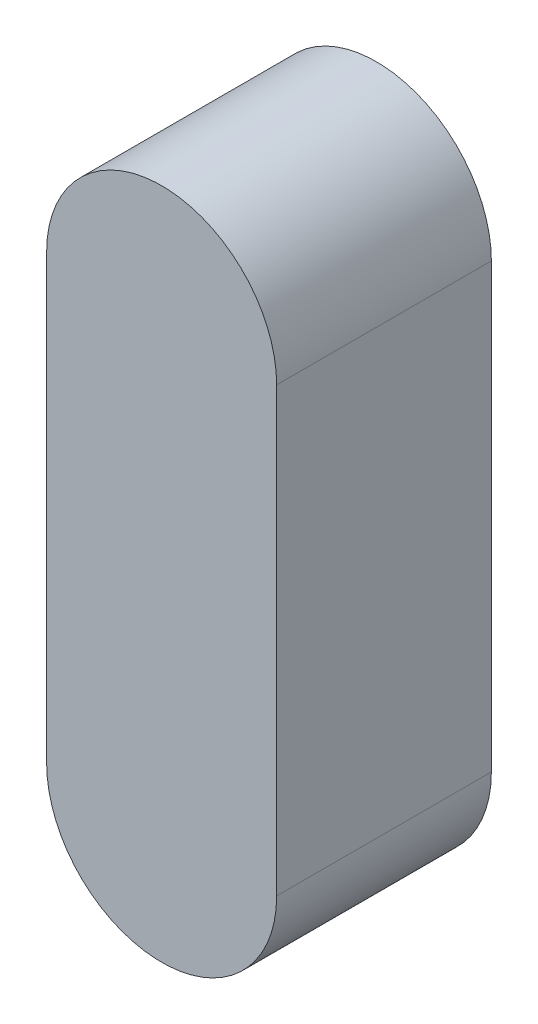
ISO-10303-21;
HEADER;
FILE_DESCRIPTION(('STEP AP214'),'2;1');
FILE_NAME('part.step','',(''),(''),'','','');
FILE_SCHEMA(('AUTOMOTIVE_DESIGN { 1 0 10303 214 1 1 1 1 }'));
ENDSEC;
DATA;
#1=APPLICATION_CONTEXT('core data for automotive mechanical design processes');
#2=APPLICATION_PROTOCOL_DEFINITION('international standard','automotive_design',2000,#1);
#3=PRODUCT_CONTEXT('',#1,'mechanical');
#4=PRODUCT('Part','Part','',(#3));
#5=PRODUCT_RELATED_PRODUCT_CATEGORY('part','',(#4));
#6=PRODUCT_DEFINITION_FORMATION('','',#4);
#7=PRODUCT_DEFINITION_CONTEXT('part definition',#1,'design');
#8=PRODUCT_DEFINITION('design','',#6,#7);
#9=PRODUCT_DEFINITION_SHAPE('','',#8);
#10=(LENGTH_UNIT() NAMED_UNIT(*) SI_UNIT(.MILLI.,.METRE.));
#11=(NAMED_UNIT(*) PLANE_ANGLE_UNIT() SI_UNIT($,.RADIAN.));
#12=(NAMED_UNIT(*) SI_UNIT($,.STERADIAN.) SOLID_ANGLE_UNIT());
#13=UNCERTAINTY_MEASURE_WITH_UNIT(LENGTH_MEASURE(1.E-05),#10,'distance_accuracy_value','');
#14=(GEOMETRIC_REPRESENTATION_CONTEXT(3) GLOBAL_UNCERTAINTY_ASSIGNED_CONTEXT((#13)) GLOBAL_UNIT_ASSIGNED_CONTEXT((#10,
#11,#12)) REPRESENTATION_CONTEXT('',''));
#15=CARTESIAN_POINT('',(0.,0.,0.));
#16=DIRECTION('',(0.,0.,1.));
#17=DIRECTION('',(1.,0.,0.));
#18=AXIS2_PLACEMENT_3D('',#15,#16,#17);
#19=CARTESIAN_POINT('',(-69.6412825171445,0.,505.419365422203));
#20=DIRECTION('',(1.,0.,0.));
#21=DIRECTION('',(0.,0.,-1.));
#22=AXIS2_PLACEMENT_3D('',#19,#20,#21);
#23=PLANE('',#22);
#24=DIRECTION('',(0.,0.,-1.));
#25=VECTOR('',#24,1.);
#26=CARTESIAN_POINT('',(-69.6412825171445,0.,505.419365422203));
#27=LINE('',#26,#25);
#28=CARTESIAN_POINT('',(-69.6412825171445,0.,65.0000000000018));
#29=VERTEX_POINT('',#28);
#30=CARTESIAN_POINT('',(-69.6412825171445,0.,-64.9999999999982));
#31=VERTEX_POINT('',#30);
#32=EDGE_CURVE('E101',#29,#31,#27,.T.);
#33=ORIENTED_EDGE('',*,*,#32,.F.);
#34=DIRECTION('',(0.,1.,0.));
#35=VECTOR('',#34,1.);
#36=CARTESIAN_POINT('',(-69.6412825171445,9.65195557238615E-13,65.0000000000018));
#37=LINE('',#36,#35);
#38=CARTESIAN_POINT('',(-69.6412825171445,267.978036065203,65.0000000000021));
#39=VERTEX_POINT('',#38);
#40=EDGE_CURVE('E43',#29,#39,#37,.T.);
#41=ORIENTED_EDGE('',*,*,#40,.T.);
#42=DIRECTION('',(0.,0.,-1.));
#43=VECTOR('',#42,1.);
#44=CARTESIAN_POINT('',(-69.6412825171445,267.978036065203,505.419365422203));
#45=LINE('',#44,#43);
#46=CARTESIAN_POINT('',(-69.6412825171445,267.978036065203,-64.9999999999977));
#47=VERTEX_POINT('',#46);
#48=EDGE_CURVE('E87',#39,#47,#45,.T.);
#49=ORIENTED_EDGE('',*,*,#48,.T.);
#50=DIRECTION('',(0.,1.,0.));
#51=VECTOR('',#50,1.);
#52=CARTESIAN_POINT('',(-69.6412825171445,-8.60556308921946E-13,-64.9999999999982));
#53=LINE('',#52,#51);
#54=EDGE_CURVE('E97',#31,#47,#53,.T.);
#55=ORIENTED_EDGE('',*,*,#54,.F.);
#56=EDGE_LOOP('',(#33,#41,#49,#55));
#57=FACE_BOUND('',#56,.T.);
#58=ADVANCED_FACE('F39',(#57),#23,.F.);
#59=CARTESIAN_POINT('',(0.,267.978036065203,505.419365422203));
#60=DIRECTION('',(0.,0.,-1.));
#61=DIRECTION('',(-1.,0.,0.));
#62=AXIS2_PLACEMENT_3D('',#59,#60,#61);
#63=CYLINDRICAL_SURFACE('',#62,69.6412825171445);
#64=ORIENTED_EDGE('',*,*,#48,.F.);
#65=CARTESIAN_POINT('',(0.,267.978036065203,65.0000000000025));
#66=DIRECTION('',(0.,0.,-0.999999999999999));
#67=DIRECTION('',(0.,1.,0.));
#68=AXIS2_PLACEMENT_3D('',#65,#66,#67);
#69=CIRCLE('',#68,69.6412825171445);
#70=CARTESIAN_POINT('',(69.6412825171445,267.978036065203,65.0000000000026));
#71=VERTEX_POINT('',#70);
#72=EDGE_CURVE('E83',#39,#71,#69,.T.);
#73=ORIENTED_EDGE('',*,*,#72,.T.);
#74=DIRECTION('',(0.,0.,-1.));
#75=VECTOR('',#74,1.);
#76=CARTESIAN_POINT('',(69.6412825171445,267.978036065203,505.419365422203));
#77=LINE('',#76,#75);
#78=CARTESIAN_POINT('',(69.6412825171445,267.978036065203,-64.9999999999978));
#79=VERTEX_POINT('',#78);
#80=EDGE_CURVE('E78',#71,#79,#77,.T.);
#81=ORIENTED_EDGE('',*,*,#80,.T.);
#82=CARTESIAN_POINT('',(0.,267.978036065203,-64.9999999999976));
#83=DIRECTION('',(0.,0.,1.));
#84=DIRECTION('',(0.,-1.,0.));
#85=AXIS2_PLACEMENT_3D('',#82,#83,#84);
#86=CIRCLE('',#85,69.6412825171445);
#87=EDGE_CURVE('E82',#47,#79,#86,.F.);
#88=ORIENTED_EDGE('',*,*,#87,.F.);
#89=EDGE_LOOP('',(#64,#73,#81,#88));
#90=FACE_BOUND('',#89,.T.);
#91=ADVANCED_FACE('F81',(#90),#63,.T.);
#92=CARTESIAN_POINT('',(69.6412825171445,0.,505.419365422203));
#93=DIRECTION('',(-1.,0.,0.));
#94=DIRECTION('',(0.,0.,1.));
#95=AXIS2_PLACEMENT_3D('',#92,#93,#94);
#96=PLANE('',#95);
#97=ORIENTED_EDGE('',*,*,#80,.F.);
#98=DIRECTION('',(0.,-1.,0.));
#99=VECTOR('',#98,1.);
#100=CARTESIAN_POINT('',(69.6412825171445,9.65195557238614E-13,65.000000000002));
#101=LINE('',#100,#99);
#102=CARTESIAN_POINT('',(69.6412825171445,0.,65.000000000002));
#103=VERTEX_POINT('',#102);
#104=EDGE_CURVE('E48',#71,#103,#101,.T.);
#105=ORIENTED_EDGE('',*,*,#104,.T.);
#106=DIRECTION('',(0.,0.,-1.));
#107=VECTOR('',#106,1.);
#108=CARTESIAN_POINT('',(69.6412825171445,0.,505.419365422203));
#109=LINE('',#108,#107);
#110=CARTESIAN_POINT('',(69.6412825171445,0.,-64.9999999999981));
#111=VERTEX_POINT('',#110);
#112=EDGE_CURVE('E86',#103,#111,#109,.T.);
#113=ORIENTED_EDGE('',*,*,#112,.T.);
#114=DIRECTION('',(0.,-1.,0.));
#115=VECTOR('',#114,1.);
#116=CARTESIAN_POINT('',(69.6412825171445,-8.60556308921946E-13,-64.9999999999981));
#117=LINE('',#116,#115);
#118=EDGE_CURVE('E94',#79,#111,#117,.T.);
#119=ORIENTED_EDGE('',*,*,#118,.F.);
#120=EDGE_LOOP('',(#97,#105,#113,#119));
#121=FACE_BOUND('',#120,.T.);
#122=ADVANCED_FACE('F99',(#121),#96,.F.);
#123=CARTESIAN_POINT('',(0.,0.,505.419365422203));
#124=DIRECTION('',(0.,0.,-1.));
#125=DIRECTION('',(-1.,0.,0.));
#126=AXIS2_PLACEMENT_3D('',#123,#124,#125);
#127=CYLINDRICAL_SURFACE('',#126,69.6412825171445);
#128=ORIENTED_EDGE('',*,*,#112,.F.);
#129=CARTESIAN_POINT('',(0.,0.,65.0000000000019));
#130=DIRECTION('',(0.,0.,-0.999999999999999));
#131=DIRECTION('',(0.,1.,0.));
#132=AXIS2_PLACEMENT_3D('',#129,#130,#131);
#133=CIRCLE('',#132,69.6412825171445);
#134=EDGE_CURVE('E11',#103,#29,#133,.T.);
#135=ORIENTED_EDGE('',*,*,#134,.T.);
#136=ORIENTED_EDGE('',*,*,#32,.T.);
#137=CARTESIAN_POINT('',(0.,0.,-64.9999999999982));
#138=DIRECTION('',(0.,0.,1.));
#139=DIRECTION('',(0.,-1.,0.));
#140=AXIS2_PLACEMENT_3D('',#137,#138,#139);
#141=CIRCLE('',#140,69.6412825171445);
#142=EDGE_CURVE('E102',#111,#31,#141,.F.);
#143=ORIENTED_EDGE('',*,*,#142,.F.);
#144=EDGE_LOOP('',(#128,#135,#136,#143));
#145=FACE_BOUND('',#144,.T.);
#146=ADVANCED_FACE('F41',(#145),#127,.T.);
#147=CARTESIAN_POINT('',(-393.720931479717,202.769567039116,65.0000000000016));
#148=DIRECTION('',(0.,0.,-0.999999999999999));
#149=DIRECTION('',(-0.901455594056718,-0.43287158828439,0.));
#150=AXIS2_PLACEMENT_3D('',#147,#148,#149);
#151=PLANE('',#150);
#152=ORIENTED_EDGE('',*,*,#104,.F.);
#153=ORIENTED_EDGE('',*,*,#72,.F.);
#154=ORIENTED_EDGE('',*,*,#40,.F.);
#155=ORIENTED_EDGE('',*,*,#134,.F.);
#156=EDGE_LOOP('',(#152,#153,#154,#155));
#157=FACE_BOUND('',#156,.T.);
#158=ADVANCED_FACE('F113',(#157),#151,.F.);
#159=CARTESIAN_POINT('',(-393.720931479717,202.769567039116,-64.9999999999983));
#160=DIRECTION('',(0.,0.,1.));
#161=DIRECTION('',(0.901455594056718,0.43287158828439,0.));
#162=AXIS2_PLACEMENT_3D('',#159,#160,#161);
#163=PLANE('',#162);
#164=ORIENTED_EDGE('',*,*,#142,.T.);
#165=ORIENTED_EDGE('',*,*,#54,.T.);
#166=ORIENTED_EDGE('',*,*,#87,.T.);
#167=ORIENTED_EDGE('',*,*,#118,.T.);
#168=EDGE_LOOP('',(#164,#165,#166,#167));
#169=FACE_BOUND('',#168,.T.);
#170=ADVANCED_FACE('F93',(#169),#163,.F.);
#171=CLOSED_SHELL('',(#58,#91,#122,#146,#158,#170));
#172=MANIFOLD_SOLID_BREP('B2',#171);
#173=ADVANCED_BREP_SHAPE_REPRESENTATION('',(#18,#172),#14);
#174=SHAPE_DEFINITION_REPRESENTATION(#9,#173);
ENDSEC;
END-ISO-10303-21;
